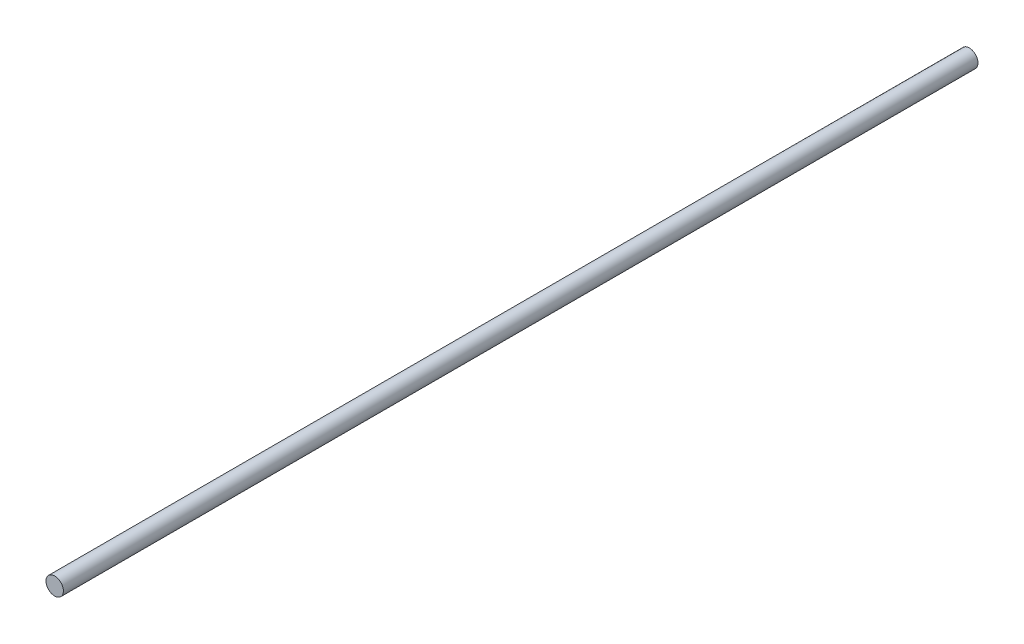
ISO-10303-21;
HEADER;
FILE_DESCRIPTION(('STEP AP214'),'2;1');
FILE_NAME('part.step','',(''),(''),'','','');
FILE_SCHEMA(('AUTOMOTIVE_DESIGN { 1 0 10303 214 1 1 1 1 }'));
ENDSEC;
DATA;
#1=APPLICATION_CONTEXT('core data for automotive mechanical design processes');
#2=APPLICATION_PROTOCOL_DEFINITION('international standard','automotive_design',2000,#1);
#3=PRODUCT_CONTEXT('',#1,'mechanical');
#4=PRODUCT('Part','Part','',(#3));
#5=PRODUCT_RELATED_PRODUCT_CATEGORY('part','',(#4));
#6=PRODUCT_DEFINITION_FORMATION('','',#4);
#7=PRODUCT_DEFINITION_CONTEXT('part definition',#1,'design');
#8=PRODUCT_DEFINITION('design','',#6,#7);
#9=PRODUCT_DEFINITION_SHAPE('','',#8);
#10=(LENGTH_UNIT() NAMED_UNIT(*) SI_UNIT(.MILLI.,.METRE.));
#11=(NAMED_UNIT(*) PLANE_ANGLE_UNIT() SI_UNIT($,.RADIAN.));
#12=(NAMED_UNIT(*) SI_UNIT($,.STERADIAN.) SOLID_ANGLE_UNIT());
#13=UNCERTAINTY_MEASURE_WITH_UNIT(LENGTH_MEASURE(1.E-05),#10,'distance_accuracy_value','');
#14=(GEOMETRIC_REPRESENTATION_CONTEXT(3) GLOBAL_UNCERTAINTY_ASSIGNED_CONTEXT((#13)) GLOBAL_UNIT_ASSIGNED_CONTEXT((#10,
#11,#12)) REPRESENTATION_CONTEXT('',''));
#15=CARTESIAN_POINT('',(0.,0.,0.));
#16=DIRECTION('',(0.,0.,1.));
#17=DIRECTION('',(1.,0.,0.));
#18=AXIS2_PLACEMENT_3D('',#15,#16,#17);
#19=CARTESIAN_POINT('',(0.,0.,500.));
#20=DIRECTION('',(0.,0.,-1.));
#21=DIRECTION('',(-1.,0.,0.));
#22=AXIS2_PLACEMENT_3D('',#19,#20,#21);
#23=CYLINDRICAL_SURFACE('',#22,4.7625);
#24=CARTESIAN_POINT('',(0.,0.,500.));
#25=DIRECTION('',(0.,0.,1.));
#26=DIRECTION('',(1.,0.,0.));
#27=AXIS2_PLACEMENT_3D('',#24,#25,#26);
#28=CIRCLE('',#27,4.7625);
#29=CARTESIAN_POINT('',(4.7625,0.,500.));
#30=VERTEX_POINT('',#29);
#31=EDGE_CURVE('E10',#30,#30,#28,.T.);
#32=ORIENTED_EDGE('',*,*,#31,.F.);
#33=EDGE_LOOP('',(#32));
#34=FACE_BOUND('',#33,.T.);
#35=CARTESIAN_POINT('',(0.,0.,0.));
#36=DIRECTION('',(0.,0.,1.));
#37=DIRECTION('',(1.,0.,0.));
#38=AXIS2_PLACEMENT_3D('',#35,#36,#37);
#39=CIRCLE('',#38,4.7625);
#40=CARTESIAN_POINT('',(4.7625,0.,0.));
#41=VERTEX_POINT('',#40);
#42=EDGE_CURVE('E34',#41,#41,#39,.T.);
#43=ORIENTED_EDGE('',*,*,#42,.T.);
#44=EDGE_LOOP('',(#43));
#45=FACE_BOUND('',#44,.T.);
#46=ADVANCED_FACE('F31',(#34,#45),#23,.T.);
#47=CARTESIAN_POINT('',(0.,0.,500.));
#48=DIRECTION('',(0.,0.,1.));
#49=DIRECTION('',(1.,0.,0.));
#50=AXIS2_PLACEMENT_3D('',#47,#48,#49);
#51=PLANE('',#50);
#52=ORIENTED_EDGE('',*,*,#31,.T.);
#53=EDGE_LOOP('',(#52));
#54=FACE_BOUND('',#53,.T.);
#55=ADVANCED_FACE('F46',(#54),#51,.T.);
#56=CARTESIAN_POINT('',(0.,0.,0.));
#57=DIRECTION('',(0.,0.,1.));
#58=DIRECTION('',(1.,0.,0.));
#59=AXIS2_PLACEMENT_3D('',#56,#57,#58);
#60=PLANE('',#59);
#61=ORIENTED_EDGE('',*,*,#42,.F.);
#62=EDGE_LOOP('',(#61));
#63=FACE_BOUND('',#62,.T.);
#64=ADVANCED_FACE('F44',(#63),#60,.F.);
#65=CLOSED_SHELL('',(#46,#55,#64));
#66=MANIFOLD_SOLID_BREP('B2',#65);
#67=ADVANCED_BREP_SHAPE_REPRESENTATION('',(#18,#66),#14);
#68=SHAPE_DEFINITION_REPRESENTATION(#9,#67);
ENDSEC;
END-ISO-10303-21;
